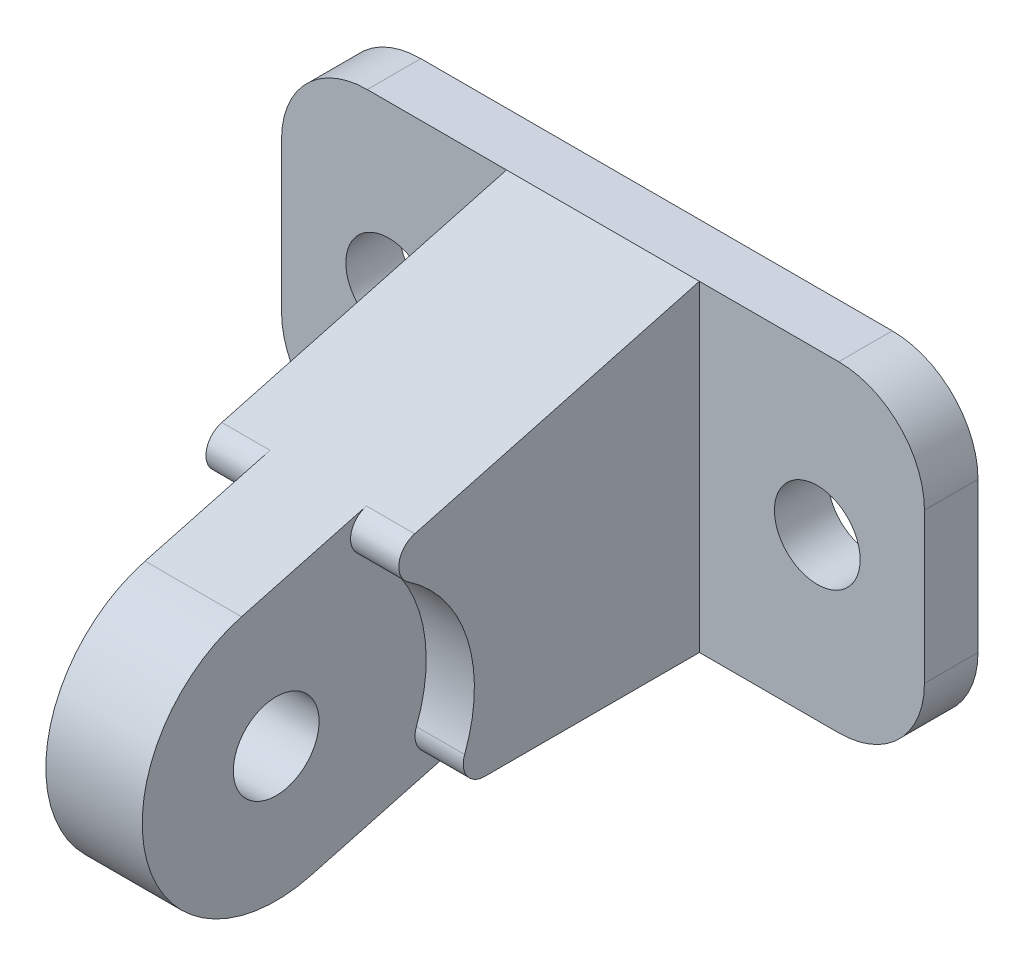
ISO-10303-21;
HEADER;
FILE_DESCRIPTION(('STEP AP214'),'2;1');
FILE_NAME('part.step','',(''),(''),'','','');
FILE_SCHEMA(('AUTOMOTIVE_DESIGN { 1 0 10303 214 1 1 1 1 }'));
ENDSEC;
DATA;
#1=APPLICATION_CONTEXT('core data for automotive mechanical design processes');
#2=APPLICATION_PROTOCOL_DEFINITION('international standard','automotive_design',2000,#1);
#3=PRODUCT_CONTEXT('',#1,'mechanical');
#4=PRODUCT('Part','Part','',(#3));
#5=PRODUCT_RELATED_PRODUCT_CATEGORY('part','',(#4));
#6=PRODUCT_DEFINITION_FORMATION('','',#4);
#7=PRODUCT_DEFINITION_CONTEXT('part definition',#1,'design');
#8=PRODUCT_DEFINITION('design','',#6,#7);
#9=PRODUCT_DEFINITION_SHAPE('','',#8);
#10=(LENGTH_UNIT() NAMED_UNIT(*) SI_UNIT(.MILLI.,.METRE.));
#11=(NAMED_UNIT(*) PLANE_ANGLE_UNIT() SI_UNIT($,.RADIAN.));
#12=(NAMED_UNIT(*) SI_UNIT($,.STERADIAN.) SOLID_ANGLE_UNIT());
#13=UNCERTAINTY_MEASURE_WITH_UNIT(LENGTH_MEASURE(1.E-05),#10,'distance_accuracy_value','');
#14=(GEOMETRIC_REPRESENTATION_CONTEXT(3) GLOBAL_UNCERTAINTY_ASSIGNED_CONTEXT((#13)) GLOBAL_UNIT_ASSIGNED_CONTEXT((#10,
#11,#12)) REPRESENTATION_CONTEXT('',''));
#15=CARTESIAN_POINT('',(0.,0.,0.));
#16=DIRECTION('',(0.,0.,1.));
#17=DIRECTION('',(1.,0.,0.));
#18=AXIS2_PLACEMENT_3D('',#15,#16,#17);
#19=CARTESIAN_POINT('',(9.,5.94769095738951,31.0562706625249));
#20=DIRECTION('',(-1.,0.,0.));
#21=DIRECTION('',(0.,0.,1.));
#22=AXIS2_PLACEMENT_3D('',#19,#20,#21);
#23=CYLINDRICAL_SURFACE('',#22,2.);
#24=DIRECTION('',(-1.,0.,0.));
#25=VECTOR('',#24,1.);
#26=CARTESIAN_POINT('',(9.,4.2893328389389,32.1742368297093));
#27=LINE('',#26,#25);
#28=CARTESIAN_POINT('',(-4.5,4.2893328389389,32.1742368297093));
#29=VERTEX_POINT('',#28);
#30=CARTESIAN_POINT('',(-9.,4.2893328389389,32.1742368297093));
#31=VERTEX_POINT('',#30);
#32=EDGE_CURVE('E280',#29,#31,#27,.T.);
#33=ORIENTED_EDGE('',*,*,#32,.F.);
#34=CARTESIAN_POINT('',(-4.5,5.94769095738951,31.0562706625249));
#35=DIRECTION('',(1.,0.,0.));
#36=DIRECTION('',(0.,0.,-1.));
#37=AXIS2_PLACEMENT_3D('',#34,#35,#36);
#38=CIRCLE('',#37,2.);
#39=CARTESIAN_POINT('',(-4.5,7.87954260996764,31.5739087527299));
#40=VERTEX_POINT('',#39);
#41=EDGE_CURVE('E476',#29,#40,#38,.F.);
#42=ORIENTED_EDGE('',*,*,#41,.T.);
#43=DIRECTION('',(-1.,0.,0.));
#44=VECTOR('',#43,1.);
#45=CARTESIAN_POINT('',(9.,7.87954260996764,31.5739087527299));
#46=LINE('',#45,#44);
#47=CARTESIAN_POINT('',(-9.,7.87954260996764,31.5739087527299));
#48=VERTEX_POINT('',#47);
#49=EDGE_CURVE('E285',#40,#48,#46,.T.);
#50=ORIENTED_EDGE('',*,*,#49,.T.);
#51=CARTESIAN_POINT('',(-9.,5.94769095738951,31.0562706625249));
#52=DIRECTION('',(-1.,0.,0.));
#53=DIRECTION('',(0.,0.,1.));
#54=AXIS2_PLACEMENT_3D('',#51,#52,#53);
#55=CIRCLE('',#54,2.);
#56=EDGE_CURVE('E223',#31,#48,#55,.T.);
#57=ORIENTED_EDGE('',*,*,#56,.F.);
#58=EDGE_LOOP('',(#33,#42,#50,#57));
#59=FACE_BOUND('',#58,.T.);
#60=ADVANCED_FACE('F45',(#59),#23,.T.);
#61=CARTESIAN_POINT('',(9.,-7.31917399021537,40.));
#62=DIRECTION('',(-1.,0.,0.));
#63=DIRECTION('',(0.,0.,1.));
#64=AXIS2_PLACEMENT_3D('',#61,#62,#63);
#65=CYLINDRICAL_SURFACE('',#64,14.);
#66=CARTESIAN_POINT('',(-4.5,-7.31917399021537,40.));
#67=DIRECTION('',(1.,0.,0.));
#68=DIRECTION('',(0.,0.,-1.));
#69=AXIS2_PLACEMENT_3D('',#66,#67,#68);
#70=CIRCLE('',#69,14.);
#71=CARTESIAN_POINT('',(-4.5,-12.2898967487769,26.9121462700136));
#72=VERTEX_POINT('',#71);
#73=EDGE_CURVE('E472',#29,#72,#70,.F.);
#74=ORIENTED_EDGE('',*,*,#73,.F.);
#75=ORIENTED_EDGE('',*,*,#32,.T.);
#76=CARTESIAN_POINT('',(-9.,-7.31917399021537,40.));
#77=DIRECTION('',(-1.,0.,0.));
#78=DIRECTION('',(0.,0.,1.));
#79=AXIS2_PLACEMENT_3D('',#76,#77,#78);
#80=CIRCLE('',#79,14.);
#81=CARTESIAN_POINT('',(-9.,-12.2898967487769,26.9121462700136));
#82=VERTEX_POINT('',#81);
#83=EDGE_CURVE('E254',#31,#82,#80,.T.);
#84=ORIENTED_EDGE('',*,*,#83,.T.);
#85=DIRECTION('',(-1.,0.,0.));
#86=VECTOR('',#85,1.);
#87=CARTESIAN_POINT('',(9.,-12.2898967487769,26.9121462700136));
#88=LINE('',#87,#86);
#89=EDGE_CURVE('E275',#72,#82,#88,.T.);
#90=ORIENTED_EDGE('',*,*,#89,.F.);
#91=EDGE_LOOP('',(#74,#75,#84,#90));
#92=FACE_BOUND('',#91,.T.);
#93=ADVANCED_FACE('F519',(#92),#65,.F.);
#94=CARTESIAN_POINT('',(9.,-13.,25.0424528800156));
#95=DIRECTION('',(-1.,0.,0.));
#96=DIRECTION('',(0.,0.,1.));
#97=AXIS2_PLACEMENT_3D('',#94,#95,#96);
#98=CYLINDRICAL_SURFACE('',#97,2.);
#99=CARTESIAN_POINT('',(-4.5,-13.,25.0424528800156));
#100=DIRECTION('',(1.,0.,0.));
#101=DIRECTION('',(0.,0.,-1.));
#102=AXIS2_PLACEMENT_3D('',#99,#100,#101);
#103=CIRCLE('',#102,2.);
#104=CARTESIAN_POINT('',(-4.5,-15.,25.0424528800156));
#105=VERTEX_POINT('',#104);
#106=EDGE_CURVE('E490',#72,#105,#103,.T.);
#107=ORIENTED_EDGE('',*,*,#106,.F.);
#108=ORIENTED_EDGE('',*,*,#89,.T.);
#109=CARTESIAN_POINT('',(-9.,-13.,25.0424528800156));
#110=DIRECTION('',(1.,0.,0.));
#111=DIRECTION('',(0.,0.,-1.));
#112=AXIS2_PLACEMENT_3D('',#109,#110,#111);
#113=CIRCLE('',#112,2.);
#114=CARTESIAN_POINT('',(-9.,-15.,25.0424528800156));
#115=VERTEX_POINT('',#114);
#116=EDGE_CURVE('E258',#82,#115,#113,.T.);
#117=ORIENTED_EDGE('',*,*,#116,.T.);
#118=DIRECTION('',(-1.,0.,0.));
#119=VECTOR('',#118,1.);
#120=CARTESIAN_POINT('',(9.,-15.,25.0424528800156));
#121=LINE('',#120,#119);
#122=EDGE_CURVE('E271',#105,#115,#121,.T.);
#123=ORIENTED_EDGE('',*,*,#122,.F.);
#124=EDGE_LOOP('',(#107,#108,#117,#123));
#125=FACE_BOUND('',#124,.T.);
#126=ADVANCED_FACE('F425',(#125),#98,.T.);
#127=CARTESIAN_POINT('',(22.,-7.,5.));
#128=DIRECTION('',(0.,0.,1.));
#129=DIRECTION('',(1.,0.,0.));
#130=AXIS2_PLACEMENT_3D('',#127,#128,#129);
#131=PLANE('',#130);
#132=CARTESIAN_POINT('',(20.,0.,5.));
#133=DIRECTION('',(0.,0.,1.));
#134=DIRECTION('',(1.,0.,0.));
#135=AXIS2_PLACEMENT_3D('',#132,#133,#134);
#136=CIRCLE('',#135,4.);
#137=CARTESIAN_POINT('',(24.,0.,5.));
#138=VERTEX_POINT('',#137);
#139=EDGE_CURVE('E290',#138,#138,#136,.T.);
#140=ORIENTED_EDGE('',*,*,#139,.F.);
#141=EDGE_LOOP('',(#140));
#142=FACE_BOUND('',#141,.T.);
#143=DIRECTION('',(-1.,0.,0.));
#144=VECTOR('',#143,1.);
#145=CARTESIAN_POINT('',(22.,15.,5.));
#146=LINE('',#145,#144);
#147=CARTESIAN_POINT('',(22.,15.,5.));
#148=VERTEX_POINT('',#147);
#149=CARTESIAN_POINT('',(9.,15.,5.));
#150=VERTEX_POINT('',#149);
#151=EDGE_CURVE('E318',#148,#150,#146,.T.);
#152=ORIENTED_EDGE('',*,*,#151,.T.);
#153=DIRECTION('',(0.,-1.,0.));
#154=VECTOR('',#153,1.);
#155=CARTESIAN_POINT('',(9.,15.,5.));
#156=LINE('',#155,#154);
#157=CARTESIAN_POINT('',(9.,-15.,5.));
#158=VERTEX_POINT('',#157);
#159=EDGE_CURVE('E246',#150,#158,#156,.T.);
#160=ORIENTED_EDGE('',*,*,#159,.T.);
#161=DIRECTION('',(1.,0.,0.));
#162=VECTOR('',#161,1.);
#163=CARTESIAN_POINT('',(22.,-15.,5.));
#164=LINE('',#163,#162);
#165=CARTESIAN_POINT('',(22.,-15.,5.));
#166=VERTEX_POINT('',#165);
#167=EDGE_CURVE('E331',#158,#166,#164,.T.);
#168=ORIENTED_EDGE('',*,*,#167,.T.);
#169=CARTESIAN_POINT('',(22.,-7.,5.));
#170=DIRECTION('',(0.,0.,1.));
#171=DIRECTION('',(1.,0.,0.));
#172=AXIS2_PLACEMENT_3D('',#169,#170,#171);
#173=CIRCLE('',#172,8.);
#174=CARTESIAN_POINT('',(30.,-6.99999999999994,5.));
#175=VERTEX_POINT('',#174);
#176=EDGE_CURVE('E306',#166,#175,#173,.T.);
#177=ORIENTED_EDGE('',*,*,#176,.T.);
#178=DIRECTION('',(0.,1.,0.));
#179=VECTOR('',#178,1.);
#180=CARTESIAN_POINT('',(30.,-6.99999999999994,5.));
#181=LINE('',#180,#179);
#182=CARTESIAN_POINT('',(30.,6.99999999999994,5.));
#183=VERTEX_POINT('',#182);
#184=EDGE_CURVE('E310',#175,#183,#181,.T.);
#185=ORIENTED_EDGE('',*,*,#184,.T.);
#186=CARTESIAN_POINT('',(22.,7.,5.));
#187=DIRECTION('',(0.,0.,1.));
#188=DIRECTION('',(1.,0.,0.));
#189=AXIS2_PLACEMENT_3D('',#186,#187,#188);
#190=CIRCLE('',#189,8.);
#191=EDGE_CURVE('E314',#183,#148,#190,.T.);
#192=ORIENTED_EDGE('',*,*,#191,.T.);
#193=EDGE_LOOP('',(#152,#160,#168,#177,#185,#192));
#194=FACE_BOUND('',#193,.T.);
#195=ADVANCED_FACE('F443',(#142,#194),#131,.T.);
#196=DIRECTION('',(0.,-1.,0.));
#197=VECTOR('',#196,1.);
#198=CARTESIAN_POINT('',(-9.,15.,5.));
#199=LINE('',#198,#197);
#200=CARTESIAN_POINT('',(-9.,15.,5.));
#201=VERTEX_POINT('',#200);
#202=CARTESIAN_POINT('',(-9.,-15.,5.));
#203=VERTEX_POINT('',#202);
#204=EDGE_CURVE('E232',#201,#203,#199,.T.);
#205=ORIENTED_EDGE('',*,*,#204,.F.);
#206=CARTESIAN_POINT('',(-21.9999999999999,15.,5.));
#207=VERTEX_POINT('',#206);
#208=EDGE_CURVE('E317',#201,#207,#146,.T.);
#209=ORIENTED_EDGE('',*,*,#208,.T.);
#210=CARTESIAN_POINT('',(-22.,7.,5.));
#211=DIRECTION('',(0.,0.,1.));
#212=DIRECTION('',(-1.,0.,0.));
#213=AXIS2_PLACEMENT_3D('',#210,#211,#212);
#214=CIRCLE('',#213,8.);
#215=CARTESIAN_POINT('',(-30.,6.99999999999994,5.));
#216=VERTEX_POINT('',#215);
#217=EDGE_CURVE('E322',#207,#216,#214,.T.);
#218=ORIENTED_EDGE('',*,*,#217,.T.);
#219=DIRECTION('',(0.,-1.,0.));
#220=VECTOR('',#219,1.);
#221=CARTESIAN_POINT('',(-30.,-6.99999999999995,5.));
#222=LINE('',#221,#220);
#223=CARTESIAN_POINT('',(-30.,-7.00000000000001,5.));
#224=VERTEX_POINT('',#223);
#225=EDGE_CURVE('E325',#216,#224,#222,.T.);
#226=ORIENTED_EDGE('',*,*,#225,.T.);
#227=CARTESIAN_POINT('',(-22.,-7.00000000000001,5.));
#228=DIRECTION('',(0.,0.,1.));
#229=DIRECTION('',(-1.,0.,0.));
#230=AXIS2_PLACEMENT_3D('',#227,#228,#229);
#231=CIRCLE('',#230,8.);
#232=CARTESIAN_POINT('',(-21.9999999999999,-15.,5.));
#233=VERTEX_POINT('',#232);
#234=EDGE_CURVE('E328',#224,#233,#231,.T.);
#235=ORIENTED_EDGE('',*,*,#234,.T.);
#236=EDGE_CURVE('E332',#233,#203,#164,.T.);
#237=ORIENTED_EDGE('',*,*,#236,.T.);
#238=EDGE_LOOP('',(#205,#209,#218,#226,#235,#237));
#239=FACE_BOUND('',#238,.T.);
#240=CARTESIAN_POINT('',(-20.,0.,5.));
#241=DIRECTION('',(0.,0.,1.));
#242=DIRECTION('',(1.,0.,0.));
#243=AXIS2_PLACEMENT_3D('',#240,#241,#242);
#244=CIRCLE('',#243,4.);
#245=CARTESIAN_POINT('',(-16.,0.,5.));
#246=VERTEX_POINT('',#245);
#247=EDGE_CURVE('E298',#246,#246,#244,.T.);
#248=ORIENTED_EDGE('',*,*,#247,.F.);
#249=EDGE_LOOP('',(#248));
#250=FACE_BOUND('',#249,.T.);
#251=ADVANCED_FACE('F410',(#239,#250),#131,.T.);
#252=CARTESIAN_POINT('',(22.,-7.,0.));
#253=DIRECTION('',(0.,0.,1.));
#254=DIRECTION('',(1.,0.,0.));
#255=AXIS2_PLACEMENT_3D('',#252,#253,#254);
#256=PLANE('',#255);
#257=CARTESIAN_POINT('',(22.,-7.,0.));
#258=DIRECTION('',(0.,0.,1.));
#259=DIRECTION('',(1.,0.,0.));
#260=AXIS2_PLACEMENT_3D('',#257,#258,#259);
#261=CIRCLE('',#260,8.);
#262=CARTESIAN_POINT('',(22.,-15.,0.));
#263=VERTEX_POINT('',#262);
#264=CARTESIAN_POINT('',(30.,-6.99999999999994,0.));
#265=VERTEX_POINT('',#264);
#266=EDGE_CURVE('E302',#263,#265,#261,.T.);
#267=ORIENTED_EDGE('',*,*,#266,.F.);
#268=DIRECTION('',(1.,0.,0.));
#269=VECTOR('',#268,1.);
#270=CARTESIAN_POINT('',(22.,-15.,0.));
#271=LINE('',#270,#269);
#272=CARTESIAN_POINT('',(-21.9999999999999,-15.,0.));
#273=VERTEX_POINT('',#272);
#274=EDGE_CURVE('E311',#273,#263,#271,.T.);
#275=ORIENTED_EDGE('',*,*,#274,.F.);
#276=CARTESIAN_POINT('',(-22.,-7.00000000000001,0.));
#277=DIRECTION('',(0.,0.,1.));
#278=DIRECTION('',(-1.,0.,0.));
#279=AXIS2_PLACEMENT_3D('',#276,#277,#278);
#280=CIRCLE('',#279,8.);
#281=CARTESIAN_POINT('',(-30.,-7.00000000000001,0.));
#282=VERTEX_POINT('',#281);
#283=EDGE_CURVE('E355',#282,#273,#280,.T.);
#284=ORIENTED_EDGE('',*,*,#283,.F.);
#285=DIRECTION('',(0.,-1.,0.));
#286=VECTOR('',#285,1.);
#287=CARTESIAN_POINT('',(-30.,-6.99999999999995,0.));
#288=LINE('',#287,#286);
#289=CARTESIAN_POINT('',(-30.,6.99999999999994,0.));
#290=VERTEX_POINT('',#289);
#291=EDGE_CURVE('E352',#290,#282,#288,.T.);
#292=ORIENTED_EDGE('',*,*,#291,.F.);
#293=CARTESIAN_POINT('',(-22.,7.,0.));
#294=DIRECTION('',(0.,0.,1.));
#295=DIRECTION('',(-1.,0.,0.));
#296=AXIS2_PLACEMENT_3D('',#293,#294,#295);
#297=CIRCLE('',#296,8.);
#298=CARTESIAN_POINT('',(-21.9999999999999,15.,0.));
#299=VERTEX_POINT('',#298);
#300=EDGE_CURVE('E349',#299,#290,#297,.T.);
#301=ORIENTED_EDGE('',*,*,#300,.F.);
#302=DIRECTION('',(-1.,0.,0.));
#303=VECTOR('',#302,1.);
#304=CARTESIAN_POINT('',(22.,15.,0.));
#305=LINE('',#304,#303);
#306=CARTESIAN_POINT('',(22.,15.,0.));
#307=VERTEX_POINT('',#306);
#308=EDGE_CURVE('E346',#307,#299,#305,.T.);
#309=ORIENTED_EDGE('',*,*,#308,.F.);
#310=CARTESIAN_POINT('',(22.,7.,0.));
#311=DIRECTION('',(0.,0.,1.));
#312=DIRECTION('',(1.,0.,0.));
#313=AXIS2_PLACEMENT_3D('',#310,#311,#312);
#314=CIRCLE('',#313,8.);
#315=CARTESIAN_POINT('',(30.,6.99999999999994,0.));
#316=VERTEX_POINT('',#315);
#317=EDGE_CURVE('E343',#316,#307,#314,.T.);
#318=ORIENTED_EDGE('',*,*,#317,.F.);
#319=DIRECTION('',(0.,1.,0.));
#320=VECTOR('',#319,1.);
#321=CARTESIAN_POINT('',(30.,-6.99999999999994,0.));
#322=LINE('',#321,#320);
#323=EDGE_CURVE('E340',#265,#316,#322,.T.);
#324=ORIENTED_EDGE('',*,*,#323,.F.);
#325=EDGE_LOOP('',(#267,#275,#284,#292,#301,#309,#318,#324));
#326=FACE_BOUND('',#325,.T.);
#327=CARTESIAN_POINT('',(-20.,0.,0.));
#328=DIRECTION('',(0.,0.,1.));
#329=DIRECTION('',(1.,0.,0.));
#330=AXIS2_PLACEMENT_3D('',#327,#328,#329);
#331=CIRCLE('',#330,4.);
#332=CARTESIAN_POINT('',(-16.,0.,0.));
#333=VERTEX_POINT('',#332);
#334=EDGE_CURVE('E294',#333,#333,#331,.T.);
#335=ORIENTED_EDGE('',*,*,#334,.T.);
#336=EDGE_LOOP('',(#335));
#337=FACE_BOUND('',#336,.T.);
#338=CARTESIAN_POINT('',(20.,0.,0.));
#339=DIRECTION('',(0.,0.,1.));
#340=DIRECTION('',(1.,0.,0.));
#341=AXIS2_PLACEMENT_3D('',#338,#339,#340);
#342=CIRCLE('',#341,4.);
#343=CARTESIAN_POINT('',(24.,0.,0.));
#344=VERTEX_POINT('',#343);
#345=EDGE_CURVE('E289',#344,#344,#342,.T.);
#346=ORIENTED_EDGE('',*,*,#345,.T.);
#347=EDGE_LOOP('',(#346));
#348=FACE_BOUND('',#347,.T.);
#349=ADVANCED_FACE('F394',(#326,#337,#348),#256,.F.);
#350=CARTESIAN_POINT('',(22.,-7.,5.));
#351=DIRECTION('',(0.,0.,-1.));
#352=DIRECTION('',(-1.,0.,0.));
#353=AXIS2_PLACEMENT_3D('',#350,#351,#352);
#354=CYLINDRICAL_SURFACE('',#353,8.);
#355=ORIENTED_EDGE('',*,*,#266,.T.);
#356=DIRECTION('',(0.,0.,-1.));
#357=VECTOR('',#356,1.);
#358=CARTESIAN_POINT('',(30.,-6.99999999999994,5.));
#359=LINE('',#358,#357);
#360=EDGE_CURVE('E11',#175,#265,#359,.T.);
#361=ORIENTED_EDGE('',*,*,#360,.F.);
#362=ORIENTED_EDGE('',*,*,#176,.F.);
#363=DIRECTION('',(0.,0.,-1.));
#364=VECTOR('',#363,1.);
#365=CARTESIAN_POINT('',(22.,-15.,5.));
#366=LINE('',#365,#364);
#367=EDGE_CURVE('E336',#166,#263,#366,.T.);
#368=ORIENTED_EDGE('',*,*,#367,.T.);
#369=EDGE_LOOP('',(#355,#361,#362,#368));
#370=FACE_BOUND('',#369,.T.);
#371=ADVANCED_FACE('F47',(#370),#354,.T.);
#372=CARTESIAN_POINT('',(30.,-6.99999999999994,5.));
#373=DIRECTION('',(-1.,0.,0.));
#374=DIRECTION('',(0.,0.,1.));
#375=AXIS2_PLACEMENT_3D('',#372,#373,#374);
#376=PLANE('',#375);
#377=ORIENTED_EDGE('',*,*,#323,.T.);
#378=DIRECTION('',(0.,0.,-1.));
#379=VECTOR('',#378,1.);
#380=CARTESIAN_POINT('',(30.,6.99999999999994,5.));
#381=LINE('',#380,#379);
#382=EDGE_CURVE('E54',#183,#316,#381,.T.);
#383=ORIENTED_EDGE('',*,*,#382,.F.);
#384=ORIENTED_EDGE('',*,*,#184,.F.);
#385=ORIENTED_EDGE('',*,*,#360,.T.);
#386=EDGE_LOOP('',(#377,#383,#384,#385));
#387=FACE_BOUND('',#386,.T.);
#388=ADVANCED_FACE('F564',(#387),#376,.F.);
#389=CARTESIAN_POINT('',(22.,7.,5.));
#390=DIRECTION('',(0.,0.,-1.));
#391=DIRECTION('',(-1.,0.,0.));
#392=AXIS2_PLACEMENT_3D('',#389,#390,#391);
#393=CYLINDRICAL_SURFACE('',#392,8.);
#394=ORIENTED_EDGE('',*,*,#317,.T.);
#395=DIRECTION('',(0.,0.,-1.));
#396=VECTOR('',#395,1.);
#397=CARTESIAN_POINT('',(22.,15.,5.));
#398=LINE('',#397,#396);
#399=EDGE_CURVE('E379',#148,#307,#398,.T.);
#400=ORIENTED_EDGE('',*,*,#399,.F.);
#401=ORIENTED_EDGE('',*,*,#191,.F.);
#402=ORIENTED_EDGE('',*,*,#382,.T.);
#403=EDGE_LOOP('',(#394,#400,#401,#402));
#404=FACE_BOUND('',#403,.T.);
#405=ADVANCED_FACE('F388',(#404),#393,.T.);
#406=CARTESIAN_POINT('',(22.,15.,5.));
#407=DIRECTION('',(0.,-1.,0.));
#408=DIRECTION('',(1.,0.,0.));
#409=AXIS2_PLACEMENT_3D('',#406,#407,#408);
#410=PLANE('',#409);
#411=ORIENTED_EDGE('',*,*,#308,.T.);
#412=DIRECTION('',(0.,0.,-1.));
#413=VECTOR('',#412,1.);
#414=CARTESIAN_POINT('',(-21.9999999999999,15.,5.));
#415=LINE('',#414,#413);
#416=EDGE_CURVE('E375',#207,#299,#415,.T.);
#417=ORIENTED_EDGE('',*,*,#416,.F.);
#418=ORIENTED_EDGE('',*,*,#208,.F.);
#419=DIRECTION('',(-1.,0.,0.));
#420=VECTOR('',#419,1.);
#421=CARTESIAN_POINT('',(9.,15.,5.));
#422=LINE('',#421,#420);
#423=EDGE_CURVE('E249',#150,#201,#422,.T.);
#424=ORIENTED_EDGE('',*,*,#423,.F.);
#425=ORIENTED_EDGE('',*,*,#151,.F.);
#426=ORIENTED_EDGE('',*,*,#399,.T.);
#427=EDGE_LOOP('',(#411,#417,#418,#424,#425,#426));
#428=FACE_BOUND('',#427,.T.);
#429=ADVANCED_FACE('F400',(#428),#410,.F.);
#430=CARTESIAN_POINT('',(-22.,7.,5.));
#431=DIRECTION('',(0.,0.,-1.));
#432=DIRECTION('',(-1.,0.,0.));
#433=AXIS2_PLACEMENT_3D('',#430,#431,#432);
#434=CYLINDRICAL_SURFACE('',#433,8.);
#435=ORIENTED_EDGE('',*,*,#300,.T.);
#436=DIRECTION('',(0.,0.,-1.));
#437=VECTOR('',#436,1.);
#438=CARTESIAN_POINT('',(-30.,6.99999999999994,5.));
#439=LINE('',#438,#437);
#440=EDGE_CURVE('E371',#216,#290,#439,.T.);
#441=ORIENTED_EDGE('',*,*,#440,.F.);
#442=ORIENTED_EDGE('',*,*,#217,.F.);
#443=ORIENTED_EDGE('',*,*,#416,.T.);
#444=EDGE_LOOP('',(#435,#441,#442,#443));
#445=FACE_BOUND('',#444,.T.);
#446=ADVANCED_FACE('F405',(#445),#434,.T.);
#447=CARTESIAN_POINT('',(-30.,-6.99999999999995,5.));
#448=DIRECTION('',(1.,0.,0.));
#449=DIRECTION('',(0.,0.,-1.));
#450=AXIS2_PLACEMENT_3D('',#447,#448,#449);
#451=PLANE('',#450);
#452=ORIENTED_EDGE('',*,*,#291,.T.);
#453=DIRECTION('',(0.,0.,-1.));
#454=VECTOR('',#453,1.);
#455=CARTESIAN_POINT('',(-30.,-7.00000000000001,5.));
#456=LINE('',#455,#454);
#457=EDGE_CURVE('E367',#224,#282,#456,.T.);
#458=ORIENTED_EDGE('',*,*,#457,.F.);
#459=ORIENTED_EDGE('',*,*,#225,.F.);
#460=ORIENTED_EDGE('',*,*,#440,.T.);
#461=EDGE_LOOP('',(#452,#458,#459,#460));
#462=FACE_BOUND('',#461,.T.);
#463=ADVANCED_FACE('F555',(#462),#451,.F.);
#464=CARTESIAN_POINT('',(-22.,-7.00000000000001,5.));
#465=DIRECTION('',(0.,0.,-1.));
#466=DIRECTION('',(-1.,0.,0.));
#467=AXIS2_PLACEMENT_3D('',#464,#465,#466);
#468=CYLINDRICAL_SURFACE('',#467,8.);
#469=ORIENTED_EDGE('',*,*,#283,.T.);
#470=DIRECTION('',(0.,0.,-1.));
#471=VECTOR('',#470,1.);
#472=CARTESIAN_POINT('',(-21.9999999999999,-15.,5.));
#473=LINE('',#472,#471);
#474=EDGE_CURVE('E363',#233,#273,#473,.T.);
#475=ORIENTED_EDGE('',*,*,#474,.F.);
#476=ORIENTED_EDGE('',*,*,#234,.F.);
#477=ORIENTED_EDGE('',*,*,#457,.T.);
#478=EDGE_LOOP('',(#469,#475,#476,#477));
#479=FACE_BOUND('',#478,.T.);
#480=ADVANCED_FACE('F552',(#479),#468,.T.);
#481=CARTESIAN_POINT('',(22.,-15.,5.));
#482=DIRECTION('',(0.,1.,0.));
#483=DIRECTION('',(-1.,0.,0.));
#484=AXIS2_PLACEMENT_3D('',#481,#482,#483);
#485=PLANE('',#484);
#486=CARTESIAN_POINT('',(9.,-15.,25.0424528800156));
#487=VERTEX_POINT('',#486);
#488=CARTESIAN_POINT('',(4.5,-15.,25.0424528800156));
#489=VERTEX_POINT('',#488);
#490=EDGE_CURVE('E272',#487,#489,#121,.T.);
#491=ORIENTED_EDGE('',*,*,#490,.T.);
#492=DIRECTION('',(0.,0.,1.));
#493=VECTOR('',#492,1.);
#494=CARTESIAN_POINT('',(4.5,-15.,0.));
#495=LINE('',#494,#493);
#496=CARTESIAN_POINT('',(4.5,-15.,20.3689415981594));
#497=VERTEX_POINT('',#496);
#498=EDGE_CURVE('E61',#497,#489,#495,.T.);
#499=ORIENTED_EDGE('',*,*,#498,.F.);
#500=DIRECTION('',(-1.,0.,0.));
#501=VECTOR('',#500,1.);
#502=CARTESIAN_POINT('',(4.5,-15.,20.3689415981594));
#503=LINE('',#502,#501);
#504=CARTESIAN_POINT('',(-4.5,-15.,20.3689415981594));
#505=VERTEX_POINT('',#504);
#506=EDGE_CURVE('E65',#497,#505,#503,.T.);
#507=ORIENTED_EDGE('',*,*,#506,.T.);
#508=DIRECTION('',(0.,0.,1.));
#509=VECTOR('',#508,1.);
#510=CARTESIAN_POINT('',(-4.5,-15.,0.));
#511=LINE('',#510,#509);
#512=EDGE_CURVE('E421',#505,#105,#511,.T.);
#513=ORIENTED_EDGE('',*,*,#512,.T.);
#514=ORIENTED_EDGE('',*,*,#122,.T.);
#515=DIRECTION('',(0.,0.,1.));
#516=VECTOR('',#515,1.);
#517=CARTESIAN_POINT('',(-9.,-15.,5.));
#518=LINE('',#517,#516);
#519=EDGE_CURVE('E262',#203,#115,#518,.T.);
#520=ORIENTED_EDGE('',*,*,#519,.F.);
#521=ORIENTED_EDGE('',*,*,#236,.F.);
#522=ORIENTED_EDGE('',*,*,#474,.T.);
#523=ORIENTED_EDGE('',*,*,#274,.T.);
#524=ORIENTED_EDGE('',*,*,#367,.F.);
#525=ORIENTED_EDGE('',*,*,#167,.F.);
#526=DIRECTION('',(0.,0.,1.));
#527=VECTOR('',#526,1.);
#528=CARTESIAN_POINT('',(9.,-15.,5.));
#529=LINE('',#528,#527);
#530=EDGE_CURVE('E242',#158,#487,#529,.T.);
#531=ORIENTED_EDGE('',*,*,#530,.T.);
#532=EDGE_LOOP('',(#491,#499,#507,#513,#514,#520,#521,#522,#523,#524,#525,#531));
#533=FACE_BOUND('',#532,.T.);
#534=ADVANCED_FACE('F419',(#533),#485,.F.);
#535=CARTESIAN_POINT('',(-20.,0.,5.));
#536=DIRECTION('',(0.,0.,-1.));
#537=DIRECTION('',(-1.,0.,0.));
#538=AXIS2_PLACEMENT_3D('',#535,#536,#537);
#539=CYLINDRICAL_SURFACE('',#538,4.);
#540=ORIENTED_EDGE('',*,*,#247,.T.);
#541=EDGE_LOOP('',(#540));
#542=FACE_BOUND('',#541,.T.);
#543=ORIENTED_EDGE('',*,*,#334,.F.);
#544=EDGE_LOOP('',(#543));
#545=FACE_BOUND('',#544,.T.);
#546=ADVANCED_FACE('F540',(#542,#545),#539,.F.);
#547=CARTESIAN_POINT('',(20.,0.,5.));
#548=DIRECTION('',(0.,0.,-1.));
#549=DIRECTION('',(-1.,0.,0.));
#550=AXIS2_PLACEMENT_3D('',#547,#548,#549);
#551=CYLINDRICAL_SURFACE('',#550,4.);
#552=ORIENTED_EDGE('',*,*,#139,.T.);
#553=EDGE_LOOP('',(#552));
#554=FACE_BOUND('',#553,.T.);
#555=ORIENTED_EDGE('',*,*,#345,.F.);
#556=EDGE_LOOP('',(#555));
#557=FACE_BOUND('',#556,.T.);
#558=ADVANCED_FACE('F535',(#554,#557),#551,.F.);
#559=CARTESIAN_POINT('',(9.,15.,5.));
#560=DIRECTION('',(0.,-0.965925826289068,-0.258819045102522));
#561=DIRECTION('',(0.,0.258819045102522,-0.965925826289068));
#562=AXIS2_PLACEMENT_3D('',#559,#560,#561);
#563=PLANE('',#562);
#564=DIRECTION('',(0.,-0.258819045102522,0.965925826289068));
#565=VECTOR('',#564,1.);
#566=CARTESIAN_POINT('',(-9.,15.,5.));
#567=LINE('',#566,#565);
#568=EDGE_CURVE('E219',#201,#48,#567,.T.);
#569=ORIENTED_EDGE('',*,*,#568,.T.);
#570=ORIENTED_EDGE('',*,*,#49,.F.);
#571=DIRECTION('',(0.,-0.258819045102522,0.965925826289068));
#572=VECTOR('',#571,1.);
#573=CARTESIAN_POINT('',(-4.5,15.2451905283833,4.08493649053892));
#574=LINE('',#573,#572);
#575=CARTESIAN_POINT('',(-4.5,4.75489883839797,43.2352380637815));
#576=VERTEX_POINT('',#575);
#577=EDGE_CURVE('E217',#40,#576,#574,.T.);
#578=ORIENTED_EDGE('',*,*,#577,.T.);
#579=DIRECTION('',(-1.,0.,0.));
#580=VECTOR('',#579,1.);
#581=CARTESIAN_POINT('',(4.5,4.75489883839797,43.2352380637815));
#582=LINE('',#581,#580);
#583=CARTESIAN_POINT('',(4.5,4.75489883839797,43.2352380637815));
#584=VERTEX_POINT('',#583);
#585=EDGE_CURVE('E194',#584,#576,#582,.T.);
#586=ORIENTED_EDGE('',*,*,#585,.F.);
#587=DIRECTION('',(0.,-0.258819045102522,0.965925826289068));
#588=VECTOR('',#587,1.);
#589=CARTESIAN_POINT('',(4.5,15.2451905283833,4.08493649053892));
#590=LINE('',#589,#588);
#591=CARTESIAN_POINT('',(4.5,7.87954260996764,31.5739087527299));
#592=VERTEX_POINT('',#591);
#593=EDGE_CURVE('E202',#592,#584,#590,.T.);
#594=ORIENTED_EDGE('',*,*,#593,.F.);
#595=CARTESIAN_POINT('',(9.,7.87954260996764,31.5739087527299));
#596=VERTEX_POINT('',#595);
#597=EDGE_CURVE('E286',#596,#592,#46,.T.);
#598=ORIENTED_EDGE('',*,*,#597,.F.);
#599=DIRECTION('',(0.,-0.258819045102522,0.965925826289068));
#600=VECTOR('',#599,1.);
#601=CARTESIAN_POINT('',(9.,15.,5.));
#602=LINE('',#601,#600);
#603=EDGE_CURVE('E228',#150,#596,#602,.T.);
#604=ORIENTED_EDGE('',*,*,#603,.F.);
#605=ORIENTED_EDGE('',*,*,#423,.T.);
#606=EDGE_LOOP('',(#569,#570,#578,#586,#594,#598,#604,#605));
#607=FACE_BOUND('',#606,.T.);
#608=ADVANCED_FACE('F214',(#607),#563,.F.);
#609=CARTESIAN_POINT('',(4.5,5.94769095738951,31.0562706625249));
#610=DIRECTION('',(1.,0.,0.));
#611=DIRECTION('',(0.,0.,-1.));
#612=AXIS2_PLACEMENT_3D('',#609,#610,#611);
#613=CIRCLE('',#612,2.);
#614=CARTESIAN_POINT('',(4.5,4.2893328389389,32.1742368297093));
#615=VERTEX_POINT('',#614);
#616=EDGE_CURVE('E208',#615,#592,#613,.F.);
#617=ORIENTED_EDGE('',*,*,#616,.F.);
#618=CARTESIAN_POINT('',(9.,4.2893328389389,32.1742368297093));
#619=VERTEX_POINT('',#618);
#620=EDGE_CURVE('E281',#619,#615,#27,.T.);
#621=ORIENTED_EDGE('',*,*,#620,.F.);
#622=CARTESIAN_POINT('',(9.,5.94769095738951,31.0562706625249));
#623=DIRECTION('',(-1.,0.,0.));
#624=DIRECTION('',(0.,0.,1.));
#625=AXIS2_PLACEMENT_3D('',#622,#623,#624);
#626=CIRCLE('',#625,2.);
#627=EDGE_CURVE('E231',#619,#596,#626,.T.);
#628=ORIENTED_EDGE('',*,*,#627,.T.);
#629=ORIENTED_EDGE('',*,*,#597,.T.);
#630=EDGE_LOOP('',(#617,#621,#628,#629));
#631=FACE_BOUND('',#630,.T.);
#632=ADVANCED_FACE('F449',(#631),#23,.T.);
#633=ORIENTED_EDGE('',*,*,#620,.T.);
#634=CARTESIAN_POINT('',(4.5,-7.31917399021537,40.));
#635=DIRECTION('',(1.,0.,0.));
#636=DIRECTION('',(0.,0.,-1.));
#637=AXIS2_PLACEMENT_3D('',#634,#635,#636);
#638=CIRCLE('',#637,14.);
#639=CARTESIAN_POINT('',(4.5,-12.2898967487769,26.9121462700136));
#640=VERTEX_POINT('',#639);
#641=EDGE_CURVE('E456',#615,#640,#638,.F.);
#642=ORIENTED_EDGE('',*,*,#641,.T.);
#643=CARTESIAN_POINT('',(9.,-12.2898967487769,26.9121462700136));
#644=VERTEX_POINT('',#643);
#645=EDGE_CURVE('E276',#644,#640,#88,.T.);
#646=ORIENTED_EDGE('',*,*,#645,.F.);
#647=CARTESIAN_POINT('',(9.,-7.31917399021537,40.));
#648=DIRECTION('',(-1.,0.,0.));
#649=DIRECTION('',(0.,0.,1.));
#650=AXIS2_PLACEMENT_3D('',#647,#648,#649);
#651=CIRCLE('',#650,14.);
#652=EDGE_CURVE('E236',#619,#644,#651,.T.);
#653=ORIENTED_EDGE('',*,*,#652,.F.);
#654=EDGE_LOOP('',(#633,#642,#646,#653));
#655=FACE_BOUND('',#654,.T.);
#656=ADVANCED_FACE('F455',(#655),#65,.F.);
#657=ORIENTED_EDGE('',*,*,#645,.T.);
#658=CARTESIAN_POINT('',(4.5,-13.,25.0424528800156));
#659=DIRECTION('',(1.,0.,0.));
#660=DIRECTION('',(0.,0.,-1.));
#661=AXIS2_PLACEMENT_3D('',#658,#659,#660);
#662=CIRCLE('',#661,2.);
#663=EDGE_CURVE('E460',#640,#489,#662,.T.);
#664=ORIENTED_EDGE('',*,*,#663,.T.);
#665=ORIENTED_EDGE('',*,*,#490,.F.);
#666=CARTESIAN_POINT('',(9.,-13.,25.0424528800156));
#667=DIRECTION('',(1.,0.,0.));
#668=DIRECTION('',(0.,0.,-1.));
#669=AXIS2_PLACEMENT_3D('',#666,#667,#668);
#670=CIRCLE('',#669,2.);
#671=EDGE_CURVE('E239',#644,#487,#670,.T.);
#672=ORIENTED_EDGE('',*,*,#671,.F.);
#673=EDGE_LOOP('',(#657,#664,#665,#672));
#674=FACE_BOUND('',#673,.T.);
#675=ADVANCED_FACE('F459',(#674),#98,.T.);
#676=CARTESIAN_POINT('',(9.,5.94769095738951,31.0562706625249));
#677=DIRECTION('',(-1.,0.,0.));
#678=DIRECTION('',(0.,0.,1.));
#679=AXIS2_PLACEMENT_3D('',#676,#677,#678);
#680=PLANE('',#679);
#681=ORIENTED_EDGE('',*,*,#603,.T.);
#682=ORIENTED_EDGE('',*,*,#627,.F.);
#683=ORIENTED_EDGE('',*,*,#652,.T.);
#684=ORIENTED_EDGE('',*,*,#671,.T.);
#685=ORIENTED_EDGE('',*,*,#530,.F.);
#686=ORIENTED_EDGE('',*,*,#159,.F.);
#687=EDGE_LOOP('',(#681,#682,#683,#684,#685,#686));
#688=FACE_BOUND('',#687,.T.);
#689=ADVANCED_FACE('F446',(#688),#680,.F.);
#690=CARTESIAN_POINT('',(-9.,5.94769095738951,31.0562706625249));
#691=DIRECTION('',(-1.,0.,0.));
#692=DIRECTION('',(0.,0.,1.));
#693=AXIS2_PLACEMENT_3D('',#690,#691,#692);
#694=PLANE('',#693);
#695=ORIENTED_EDGE('',*,*,#568,.F.);
#696=ORIENTED_EDGE('',*,*,#204,.T.);
#697=ORIENTED_EDGE('',*,*,#519,.T.);
#698=ORIENTED_EDGE('',*,*,#116,.F.);
#699=ORIENTED_EDGE('',*,*,#83,.F.);
#700=ORIENTED_EDGE('',*,*,#56,.T.);
#701=EDGE_LOOP('',(#695,#696,#697,#698,#699,#700));
#702=FACE_BOUND('',#701,.T.);
#703=ADVANCED_FACE('F430',(#702),#694,.T.);
#704=CARTESIAN_POINT('',(4.5,-7.31917399021537,40.));
#705=DIRECTION('',(-1.,0.,0.));
#706=DIRECTION('',(0.,0.,1.));
#707=AXIS2_PLACEMENT_3D('',#704,#705,#706);
#708=CYLINDRICAL_SURFACE('',#707,12.5);
#709=CARTESIAN_POINT('',(-4.5,-7.31917399021537,40.));
#710=DIRECTION('',(1.,0.,0.));
#711=DIRECTION('',(0.,0.,-1.));
#712=AXIS2_PLACEMENT_3D('',#709,#710,#711);
#713=CIRCLE('',#712,12.5);
#714=CARTESIAN_POINT('',(-4.5,-19.3932468188287,36.7647619362185));
#715=VERTEX_POINT('',#714);
#716=EDGE_CURVE('E481',#576,#715,#713,.T.);
#717=ORIENTED_EDGE('',*,*,#716,.T.);
#718=DIRECTION('',(-1.,0.,0.));
#719=VECTOR('',#718,1.);
#720=CARTESIAN_POINT('',(4.5,-19.3932468188287,36.7647619362185));
#721=LINE('',#720,#719);
#722=CARTESIAN_POINT('',(4.5,-19.3932468188287,36.7647619362185));
#723=VERTEX_POINT('',#722);
#724=EDGE_CURVE('E196',#723,#715,#721,.T.);
#725=ORIENTED_EDGE('',*,*,#724,.F.);
#726=CARTESIAN_POINT('',(4.5,-7.31917399021537,40.));
#727=DIRECTION('',(1.,0.,0.));
#728=DIRECTION('',(0.,0.,-1.));
#729=AXIS2_PLACEMENT_3D('',#726,#727,#728);
#730=CIRCLE('',#729,12.5);
#731=EDGE_CURVE('E189',#584,#723,#730,.T.);
#732=ORIENTED_EDGE('',*,*,#731,.F.);
#733=ORIENTED_EDGE('',*,*,#585,.T.);
#734=EDGE_LOOP('',(#717,#725,#732,#733));
#735=FACE_BOUND('',#734,.T.);
#736=ADVANCED_FACE('F192',(#735),#708,.T.);
#737=CARTESIAN_POINT('',(4.5,-8.90295512884341,-2.38553963702413));
#738=DIRECTION('',(0.,-0.965925826289068,-0.258819045102522));
#739=DIRECTION('',(0.,0.258819045102522,-0.965925826289068));
#740=AXIS2_PLACEMENT_3D('',#737,#738,#739);
#741=PLANE('',#740);
#742=DIRECTION('',(0.,-0.258819045102522,0.965925826289068));
#743=VECTOR('',#742,1.);
#744=CARTESIAN_POINT('',(-4.5,-8.90295512884341,-2.38553963702413));
#745=LINE('',#744,#743);
#746=EDGE_CURVE('E484',#505,#715,#745,.T.);
#747=ORIENTED_EDGE('',*,*,#746,.F.);
#748=ORIENTED_EDGE('',*,*,#506,.F.);
#749=DIRECTION('',(0.,-0.258819045102522,0.965925826289068));
#750=VECTOR('',#749,1.);
#751=CARTESIAN_POINT('',(4.5,-8.90295512884341,-2.38553963702413));
#752=LINE('',#751,#750);
#753=EDGE_CURVE('E201',#497,#723,#752,.T.);
#754=ORIENTED_EDGE('',*,*,#753,.T.);
#755=ORIENTED_EDGE('',*,*,#724,.T.);
#756=EDGE_LOOP('',(#747,#748,#754,#755));
#757=FACE_BOUND('',#756,.T.);
#758=ADVANCED_FACE('F516',(#757),#741,.T.);
#759=CARTESIAN_POINT('',(4.5,-7.31917399021537,40.));
#760=DIRECTION('',(-1.,0.,0.));
#761=DIRECTION('',(0.,0.,1.));
#762=AXIS2_PLACEMENT_3D('',#759,#760,#761);
#763=CYLINDRICAL_SURFACE('',#762,4.);
#764=CARTESIAN_POINT('',(4.5,-7.31917399021537,40.));
#765=DIRECTION('',(1.,0.,0.));
#766=DIRECTION('',(0.,0.,-1.));
#767=AXIS2_PLACEMENT_3D('',#764,#765,#766);
#768=CIRCLE('',#767,4.);
#769=CARTESIAN_POINT('',(4.5,-7.31917399021537,36.));
#770=VERTEX_POINT('',#769);
#771=EDGE_CURVE('E492',#770,#770,#768,.T.);
#772=ORIENTED_EDGE('',*,*,#771,.T.);
#773=EDGE_LOOP('',(#772));
#774=FACE_BOUND('',#773,.T.);
#775=CARTESIAN_POINT('',(-4.5,-7.31917399021537,40.));
#776=DIRECTION('',(1.,0.,0.));
#777=DIRECTION('',(0.,0.,-1.));
#778=AXIS2_PLACEMENT_3D('',#775,#776,#777);
#779=CIRCLE('',#778,4.);
#780=CARTESIAN_POINT('',(-4.5,-7.31917399021537,36.));
#781=VERTEX_POINT('',#780);
#782=EDGE_CURVE('E468',#781,#781,#779,.T.);
#783=ORIENTED_EDGE('',*,*,#782,.F.);
#784=EDGE_LOOP('',(#783));
#785=FACE_BOUND('',#784,.T.);
#786=ADVANCED_FACE('F504',(#774,#785),#763,.F.);
#787=CARTESIAN_POINT('',(4.5,0.,0.));
#788=DIRECTION('',(1.,0.,0.));
#789=DIRECTION('',(0.,0.,-1.));
#790=AXIS2_PLACEMENT_3D('',#787,#788,#789);
#791=PLANE('',#790);
#792=ORIENTED_EDGE('',*,*,#771,.F.);
#793=EDGE_LOOP('',(#792));
#794=FACE_BOUND('',#793,.T.);
#795=ORIENTED_EDGE('',*,*,#641,.F.);
#796=ORIENTED_EDGE('',*,*,#616,.T.);
#797=ORIENTED_EDGE('',*,*,#593,.T.);
#798=ORIENTED_EDGE('',*,*,#731,.T.);
#799=ORIENTED_EDGE('',*,*,#753,.F.);
#800=ORIENTED_EDGE('',*,*,#498,.T.);
#801=ORIENTED_EDGE('',*,*,#663,.F.);
#802=EDGE_LOOP('',(#795,#796,#797,#798,#799,#800,#801));
#803=FACE_BOUND('',#802,.T.);
#804=ADVANCED_FACE('F207',(#794,#803),#791,.T.);
#805=CARTESIAN_POINT('',(-4.5,0.,0.));
#806=DIRECTION('',(1.,0.,0.));
#807=DIRECTION('',(0.,0.,-1.));
#808=AXIS2_PLACEMENT_3D('',#805,#806,#807);
#809=PLANE('',#808);
#810=ORIENTED_EDGE('',*,*,#782,.T.);
#811=EDGE_LOOP('',(#810));
#812=FACE_BOUND('',#811,.T.);
#813=ORIENTED_EDGE('',*,*,#73,.T.);
#814=ORIENTED_EDGE('',*,*,#106,.T.);
#815=ORIENTED_EDGE('',*,*,#512,.F.);
#816=ORIENTED_EDGE('',*,*,#746,.T.);
#817=ORIENTED_EDGE('',*,*,#716,.F.);
#818=ORIENTED_EDGE('',*,*,#577,.F.);
#819=ORIENTED_EDGE('',*,*,#41,.F.);
#820=EDGE_LOOP('',(#813,#814,#815,#816,#817,#818,#819));
#821=FACE_BOUND('',#820,.T.);
#822=ADVANCED_FACE('F508',(#812,#821),#809,.F.);
#823=CLOSED_SHELL('',(#60,#93,#126,#195,#251,#349,#371,#388,#405,#429,#446,#463,#480,#534,#546,
#558,#608,#632,#656,#675,#689,#703,#736,#758,#786,#804,#822));
#824=MANIFOLD_SOLID_BREP('B2',#823);
#825=ADVANCED_BREP_SHAPE_REPRESENTATION('',(#18,#824),#14);
#826=SHAPE_DEFINITION_REPRESENTATION(#9,#825);
ENDSEC;
END-ISO-10303-21;
